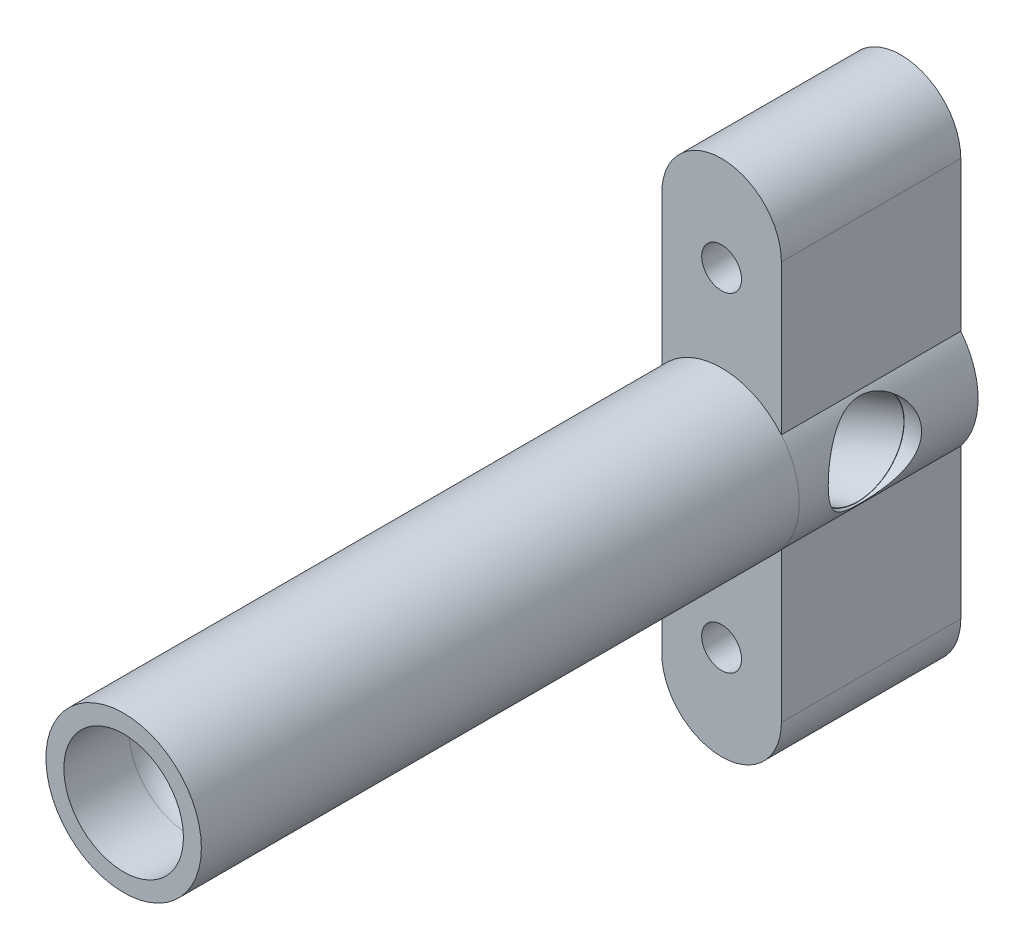
ISO-10303-21;
HEADER;
FILE_DESCRIPTION(('STEP AP214'),'2;1');
FILE_NAME('part.step','',(''),(''),'','','');
FILE_SCHEMA(('AUTOMOTIVE_DESIGN { 1 0 10303 214 1 1 1 1 }'));
ENDSEC;
DATA;
#1=APPLICATION_CONTEXT('core data for automotive mechanical design processes');
#2=APPLICATION_PROTOCOL_DEFINITION('international standard','automotive_design',2000,#1);
#3=PRODUCT_CONTEXT('',#1,'mechanical');
#4=PRODUCT('Part','Part','',(#3));
#5=PRODUCT_RELATED_PRODUCT_CATEGORY('part','',(#4));
#6=PRODUCT_DEFINITION_FORMATION('','',#4);
#7=PRODUCT_DEFINITION_CONTEXT('part definition',#1,'design');
#8=PRODUCT_DEFINITION('design','',#6,#7);
#9=PRODUCT_DEFINITION_SHAPE('','',#8);
#10=(LENGTH_UNIT() NAMED_UNIT(*) SI_UNIT(.MILLI.,.METRE.));
#11=(NAMED_UNIT(*) PLANE_ANGLE_UNIT() SI_UNIT($,.RADIAN.));
#12=(NAMED_UNIT(*) SI_UNIT($,.STERADIAN.) SOLID_ANGLE_UNIT());
#13=UNCERTAINTY_MEASURE_WITH_UNIT(LENGTH_MEASURE(1.E-05),#10,'distance_accuracy_value','');
#14=(GEOMETRIC_REPRESENTATION_CONTEXT(3) GLOBAL_UNCERTAINTY_ASSIGNED_CONTEXT((#13)) GLOBAL_UNIT_ASSIGNED_CONTEXT((#10,
#11,#12)) REPRESENTATION_CONTEXT('',''));
#15=CARTESIAN_POINT('',(0.,0.,0.));
#16=DIRECTION('',(0.,0.,1.));
#17=DIRECTION('',(1.,0.,0.));
#18=AXIS2_PLACEMENT_3D('',#15,#16,#17);
#19=CARTESIAN_POINT('',(0.,0.,30.));
#20=DIRECTION('',(0.,0.,-1.));
#21=DIRECTION('',(-1.,0.,0.));
#22=AXIS2_PLACEMENT_3D('',#19,#20,#21);
#23=CYLINDRICAL_SURFACE('',#22,2.);
#24=CARTESIAN_POINT('',(0.,0.,24.0862994965043));
#25=DIRECTION('',(0.,0.,-1.));
#26=DIRECTION('',(-1.,0.,0.));
#27=AXIS2_PLACEMENT_3D('',#24,#25,#26);
#28=CIRCLE('',#27,2.);
#29=CARTESIAN_POINT('',(-2.,0.,24.0862994965043));
#30=VERTEX_POINT('',#29);
#31=EDGE_CURVE('E101',#30,#30,#28,.F.);
#32=ORIENTED_EDGE('',*,*,#31,.T.);
#33=EDGE_LOOP('',(#32));
#34=FACE_BOUND('',#33,.T.);
#35=CARTESIAN_POINT('',(0.,0.,0.));
#36=DIRECTION('',(0.,0.,1.));
#37=DIRECTION('',(1.,0.,0.));
#38=AXIS2_PLACEMENT_3D('',#35,#36,#37);
#39=CIRCLE('',#38,2.);
#40=CARTESIAN_POINT('',(2.,0.,0.));
#41=VERTEX_POINT('',#40);
#42=EDGE_CURVE('E227',#41,#41,#39,.T.);
#43=ORIENTED_EDGE('',*,*,#42,.F.);
#44=EDGE_LOOP('',(#43));
#45=FACE_BOUND('',#44,.T.);
#46=ADVANCED_FACE('F93',(#34,#45),#23,.F.);
#47=CARTESIAN_POINT('',(0.,0.,0.));
#48=DIRECTION('',(0.,0.,1.));
#49=DIRECTION('',(1.,0.,0.));
#50=AXIS2_PLACEMENT_3D('',#47,#48,#49);
#51=PLANE('',#50);
#52=CARTESIAN_POINT('',(-0.128897569432405,0.,0.));
#53=DIRECTION('',(0.,0.,-1.));
#54=DIRECTION('',(-1.,0.,0.));
#55=AXIS2_PLACEMENT_3D('',#52,#53,#54);
#56=CIRCLE('',#55,4.);
#57=CARTESIAN_POINT('',(3.,2.49198715887542,0.));
#58=VERTEX_POINT('',#57);
#59=CARTESIAN_POINT('',(3.,-2.49198715887542,0.));
#60=VERTEX_POINT('',#59);
#61=EDGE_CURVE('E163',#58,#60,#56,.T.);
#62=ORIENTED_EDGE('',*,*,#61,.F.);
#63=CARTESIAN_POINT('',(0.,0.,0.));
#64=DIRECTION('',(0.,0.,1.));
#65=DIRECTION('',(1.,0.,0.));
#66=AXIS2_PLACEMENT_3D('',#63,#64,#65);
#67=CIRCLE('',#66,3.9);
#68=EDGE_CURVE('E211',#60,#58,#67,.T.);
#69=ORIENTED_EDGE('',*,*,#68,.F.);
#70=EDGE_LOOP('',(#62,#69));
#71=FACE_BOUND('',#70,.T.);
#72=ADVANCED_FACE('F241',(#71),#51,.F.);
#73=CARTESIAN_POINT('',(3.,10.,-9.));
#74=DIRECTION('',(-1.,0.,0.));
#75=DIRECTION('',(0.,-1.,0.));
#76=AXIS2_PLACEMENT_3D('',#73,#74,#75);
#77=PLANE('',#76);
#78=DIRECTION('',(0.,0.,1.));
#79=VECTOR('',#78,1.);
#80=CARTESIAN_POINT('',(3.,-2.49198715887542,-9.));
#81=LINE('',#80,#79);
#82=CARTESIAN_POINT('',(3.,-2.49198715887542,-9.));
#83=VERTEX_POINT('',#82);
#84=EDGE_CURVE('E108',#83,#60,#81,.T.);
#85=ORIENTED_EDGE('',*,*,#84,.T.);
#86=DIRECTION('',(0.,-1.,0.));
#87=VECTOR('',#86,1.);
#88=CARTESIAN_POINT('',(3.,10.,0.));
#89=LINE('',#88,#87);
#90=CARTESIAN_POINT('',(3.,-10.,0.));
#91=VERTEX_POINT('',#90);
#92=EDGE_CURVE('E192',#60,#91,#89,.T.);
#93=ORIENTED_EDGE('',*,*,#92,.T.);
#94=DIRECTION('',(0.,0.,1.));
#95=VECTOR('',#94,1.);
#96=CARTESIAN_POINT('',(3.,-10.,-9.));
#97=LINE('',#96,#95);
#98=CARTESIAN_POINT('',(3.,-10.,-9.));
#99=VERTEX_POINT('',#98);
#100=EDGE_CURVE('E206',#99,#91,#97,.T.);
#101=ORIENTED_EDGE('',*,*,#100,.F.);
#102=DIRECTION('',(0.,-1.,0.));
#103=VECTOR('',#102,1.);
#104=CARTESIAN_POINT('',(3.,10.,-9.));
#105=LINE('',#104,#103);
#106=EDGE_CURVE('E178',#83,#99,#105,.T.);
#107=ORIENTED_EDGE('',*,*,#106,.F.);
#108=EDGE_LOOP('',(#85,#93,#101,#107));
#109=FACE_BOUND('',#108,.T.);
#110=ADVANCED_FACE('F388',(#109),#77,.F.);
#111=DIRECTION('',(0.,0.,1.));
#112=VECTOR('',#111,1.);
#113=CARTESIAN_POINT('',(3.,2.49198715887542,-9.));
#114=LINE('',#113,#112);
#115=CARTESIAN_POINT('',(3.,2.49198715887542,-9.));
#116=VERTEX_POINT('',#115);
#117=EDGE_CURVE('E158',#116,#58,#114,.T.);
#118=ORIENTED_EDGE('',*,*,#117,.F.);
#119=CARTESIAN_POINT('',(3.,10.,-9.));
#120=VERTEX_POINT('',#119);
#121=EDGE_CURVE('E169',#120,#116,#105,.T.);
#122=ORIENTED_EDGE('',*,*,#121,.F.);
#123=DIRECTION('',(0.,0.,1.));
#124=VECTOR('',#123,1.);
#125=CARTESIAN_POINT('',(3.,10.,-9.));
#126=LINE('',#125,#124);
#127=CARTESIAN_POINT('',(3.,10.,0.));
#128=VERTEX_POINT('',#127);
#129=EDGE_CURVE('E209',#120,#128,#126,.T.);
#130=ORIENTED_EDGE('',*,*,#129,.T.);
#131=EDGE_CURVE('E171',#128,#58,#89,.T.);
#132=ORIENTED_EDGE('',*,*,#131,.T.);
#133=EDGE_LOOP('',(#118,#122,#130,#132));
#134=FACE_BOUND('',#133,.T.);
#135=ADVANCED_FACE('F167',(#134),#77,.F.);
#136=CARTESIAN_POINT('',(0.128897569432415,0.,0.));
#137=DIRECTION('',(0.,0.,-1.));
#138=DIRECTION('',(-1.,0.,0.));
#139=AXIS2_PLACEMENT_3D('',#136,#137,#138);
#140=CIRCLE('',#139,4.00000000000001);
#141=CARTESIAN_POINT('',(-3.,-2.49198715887542,0.));
#142=VERTEX_POINT('',#141);
#143=CARTESIAN_POINT('',(-3.,2.49198715887542,0.));
#144=VERTEX_POINT('',#143);
#145=EDGE_CURVE('E351',#142,#144,#140,.T.);
#146=ORIENTED_EDGE('',*,*,#145,.F.);
#147=EDGE_CURVE('E219',#144,#142,#67,.T.);
#148=ORIENTED_EDGE('',*,*,#147,.F.);
#149=EDGE_LOOP('',(#146,#148));
#150=FACE_BOUND('',#149,.T.);
#151=ADVANCED_FACE('F251',(#150),#51,.F.);
#152=CARTESIAN_POINT('',(-3.,10.,-9.));
#153=DIRECTION('',(1.,0.,0.));
#154=DIRECTION('',(0.,1.,0.));
#155=AXIS2_PLACEMENT_3D('',#152,#153,#154);
#156=PLANE('',#155);
#157=DIRECTION('',(0.,0.,1.));
#158=VECTOR('',#157,1.);
#159=CARTESIAN_POINT('',(-3.,2.49198715887542,-9.));
#160=LINE('',#159,#158);
#161=CARTESIAN_POINT('',(-3.,2.49198715887542,-9.));
#162=VERTEX_POINT('',#161);
#163=EDGE_CURVE('E116',#162,#144,#160,.T.);
#164=ORIENTED_EDGE('',*,*,#163,.T.);
#165=DIRECTION('',(0.,1.,0.));
#166=VECTOR('',#165,1.);
#167=CARTESIAN_POINT('',(-3.,10.,0.));
#168=LINE('',#167,#166);
#169=CARTESIAN_POINT('',(-3.,10.,0.));
#170=VERTEX_POINT('',#169);
#171=EDGE_CURVE('E197',#144,#170,#168,.T.);
#172=ORIENTED_EDGE('',*,*,#171,.T.);
#173=DIRECTION('',(0.,0.,1.));
#174=VECTOR('',#173,1.);
#175=CARTESIAN_POINT('',(-3.,10.,-9.));
#176=LINE('',#175,#174);
#177=CARTESIAN_POINT('',(-3.,10.,-9.));
#178=VERTEX_POINT('',#177);
#179=EDGE_CURVE('E188',#178,#170,#176,.T.);
#180=ORIENTED_EDGE('',*,*,#179,.F.);
#181=DIRECTION('',(0.,1.,0.));
#182=VECTOR('',#181,1.);
#183=CARTESIAN_POINT('',(-3.,10.,-9.));
#184=LINE('',#183,#182);
#185=EDGE_CURVE('E180',#162,#178,#184,.T.);
#186=ORIENTED_EDGE('',*,*,#185,.F.);
#187=EDGE_LOOP('',(#164,#172,#180,#186));
#188=FACE_BOUND('',#187,.T.);
#189=ADVANCED_FACE('F254',(#188),#156,.F.);
#190=DIRECTION('',(0.,0.,1.));
#191=VECTOR('',#190,1.);
#192=CARTESIAN_POINT('',(-3.,-2.49198715887542,-9.));
#193=LINE('',#192,#191);
#194=CARTESIAN_POINT('',(-3.,-2.49198715887542,-9.));
#195=VERTEX_POINT('',#194);
#196=EDGE_CURVE('E354',#195,#142,#193,.T.);
#197=ORIENTED_EDGE('',*,*,#196,.F.);
#198=CARTESIAN_POINT('',(-3.,-10.,-9.));
#199=VERTEX_POINT('',#198);
#200=EDGE_CURVE('E185',#199,#195,#184,.T.);
#201=ORIENTED_EDGE('',*,*,#200,.F.);
#202=DIRECTION('',(0.,0.,1.));
#203=VECTOR('',#202,1.);
#204=CARTESIAN_POINT('',(-3.,-10.,-9.));
#205=LINE('',#204,#203);
#206=CARTESIAN_POINT('',(-3.,-10.,0.));
#207=VERTEX_POINT('',#206);
#208=EDGE_CURVE('E203',#199,#207,#205,.T.);
#209=ORIENTED_EDGE('',*,*,#208,.T.);
#210=EDGE_CURVE('E198',#207,#142,#168,.T.);
#211=ORIENTED_EDGE('',*,*,#210,.T.);
#212=EDGE_LOOP('',(#197,#201,#209,#211));
#213=FACE_BOUND('',#212,.T.);
#214=ADVANCED_FACE('F249',(#213),#156,.F.);
#215=CARTESIAN_POINT('',(0.,0.,30.));
#216=DIRECTION('',(0.,0.,1.));
#217=DIRECTION('',(1.,0.,0.));
#218=AXIS2_PLACEMENT_3D('',#215,#216,#217);
#219=PLANE('',#218);
#220=CARTESIAN_POINT('',(0.,0.,30.));
#221=DIRECTION('',(0.,0.,1.));
#222=DIRECTION('',(1.,0.,0.));
#223=AXIS2_PLACEMENT_3D('',#220,#221,#222);
#224=CIRCLE('',#223,3.);
#225=CARTESIAN_POINT('',(3.,0.,30.));
#226=VERTEX_POINT('',#225);
#227=EDGE_CURVE('E281',#226,#226,#224,.T.);
#228=ORIENTED_EDGE('',*,*,#227,.F.);
#229=EDGE_LOOP('',(#228));
#230=FACE_BOUND('',#229,.T.);
#231=CARTESIAN_POINT('',(0.,0.,30.));
#232=DIRECTION('',(0.,0.,1.));
#233=DIRECTION('',(1.,0.,0.));
#234=AXIS2_PLACEMENT_3D('',#231,#232,#233);
#235=CIRCLE('',#234,3.9);
#236=CARTESIAN_POINT('',(3.9,0.,30.));
#237=VERTEX_POINT('',#236);
#238=EDGE_CURVE('E212',#237,#237,#235,.T.);
#239=ORIENTED_EDGE('',*,*,#238,.T.);
#240=EDGE_LOOP('',(#239));
#241=FACE_BOUND('',#240,.T.);
#242=ADVANCED_FACE('F245',(#230,#241),#219,.T.);
#243=CARTESIAN_POINT('',(0.,0.,30.));
#244=DIRECTION('',(0.,0.,-1.));
#245=DIRECTION('',(-1.,0.,0.));
#246=AXIS2_PLACEMENT_3D('',#243,#244,#245);
#247=CYLINDRICAL_SURFACE('',#246,3.9);
#248=ORIENTED_EDGE('',*,*,#238,.F.);
#249=EDGE_LOOP('',(#248));
#250=FACE_BOUND('',#249,.T.);
#251=EDGE_CURVE('E216',#58,#144,#67,.T.);
#252=ORIENTED_EDGE('',*,*,#251,.T.);
#253=ORIENTED_EDGE('',*,*,#147,.T.);
#254=EDGE_CURVE('E403',#142,#60,#67,.T.);
#255=ORIENTED_EDGE('',*,*,#254,.T.);
#256=ORIENTED_EDGE('',*,*,#68,.T.);
#257=EDGE_LOOP('',(#252,#253,#255,#256));
#258=FACE_BOUND('',#257,.T.);
#259=ADVANCED_FACE('F248',(#250,#258),#247,.T.);
#260=CARTESIAN_POINT('',(0.,10.,0.));
#261=DIRECTION('',(0.,0.,-1.));
#262=DIRECTION('',(-1.,0.,0.));
#263=AXIS2_PLACEMENT_3D('',#260,#261,#262);
#264=PLANE('',#263);
#265=CARTESIAN_POINT('',(0.,-8.25,0.));
#266=DIRECTION('',(0.,0.,-1.));
#267=DIRECTION('',(-1.,0.,0.));
#268=AXIS2_PLACEMENT_3D('',#265,#266,#267);
#269=CIRCLE('',#268,1.);
#270=CARTESIAN_POINT('',(-1.,-8.25,0.));
#271=VERTEX_POINT('',#270);
#272=EDGE_CURVE('E361',#271,#271,#269,.T.);
#273=ORIENTED_EDGE('',*,*,#272,.T.);
#274=EDGE_LOOP('',(#273));
#275=FACE_BOUND('',#274,.T.);
#276=ORIENTED_EDGE('',*,*,#254,.F.);
#277=ORIENTED_EDGE('',*,*,#210,.F.);
#278=CARTESIAN_POINT('',(0.,-10.,0.));
#279=DIRECTION('',(0.,0.,-1.));
#280=DIRECTION('',(-1.,0.,0.));
#281=AXIS2_PLACEMENT_3D('',#278,#279,#280);
#282=CIRCLE('',#281,3.);
#283=EDGE_CURVE('E195',#91,#207,#282,.T.);
#284=ORIENTED_EDGE('',*,*,#283,.F.);
#285=ORIENTED_EDGE('',*,*,#92,.F.);
#286=EDGE_LOOP('',(#276,#277,#284,#285));
#287=FACE_BOUND('',#286,.T.);
#288=ADVANCED_FACE('F257',(#275,#287),#264,.F.);
#289=CARTESIAN_POINT('',(0.,10.,-9.));
#290=DIRECTION('',(0.,0.,-1.));
#291=DIRECTION('',(-1.,0.,0.));
#292=AXIS2_PLACEMENT_3D('',#289,#290,#291);
#293=PLANE('',#292);
#294=CARTESIAN_POINT('',(0.,-8.25,-9.));
#295=DIRECTION('',(0.,0.,-1.));
#296=DIRECTION('',(-1.,0.,0.));
#297=AXIS2_PLACEMENT_3D('',#294,#295,#296);
#298=CIRCLE('',#297,1.);
#299=CARTESIAN_POINT('',(-1.,-8.25,-9.));
#300=VERTEX_POINT('',#299);
#301=EDGE_CURVE('E358',#300,#300,#298,.T.);
#302=ORIENTED_EDGE('',*,*,#301,.F.);
#303=EDGE_LOOP('',(#302));
#304=FACE_BOUND('',#303,.T.);
#305=CARTESIAN_POINT('',(0.,8.25,-9.));
#306=DIRECTION('',(0.,0.,-1.));
#307=DIRECTION('',(-1.,0.,0.));
#308=AXIS2_PLACEMENT_3D('',#305,#306,#307);
#309=CIRCLE('',#308,1.);
#310=CARTESIAN_POINT('',(-1.,8.25,-9.));
#311=VERTEX_POINT('',#310);
#312=EDGE_CURVE('E222',#311,#311,#309,.T.);
#313=ORIENTED_EDGE('',*,*,#312,.F.);
#314=EDGE_LOOP('',(#313));
#315=FACE_BOUND('',#314,.T.);
#316=CARTESIAN_POINT('',(0.,10.,-9.));
#317=DIRECTION('',(0.,0.,-1.));
#318=DIRECTION('',(-1.,0.,0.));
#319=AXIS2_PLACEMENT_3D('',#316,#317,#318);
#320=CIRCLE('',#319,3.);
#321=EDGE_CURVE('E175',#178,#120,#320,.T.);
#322=ORIENTED_EDGE('',*,*,#321,.T.);
#323=ORIENTED_EDGE('',*,*,#121,.T.);
#324=CARTESIAN_POINT('',(-0.128897569432405,0.,-9.));
#325=DIRECTION('',(0.,0.,-1.));
#326=DIRECTION('',(-1.,0.,0.));
#327=AXIS2_PLACEMENT_3D('',#324,#325,#326);
#328=CIRCLE('',#327,4.);
#329=EDGE_CURVE('E155',#116,#83,#328,.T.);
#330=ORIENTED_EDGE('',*,*,#329,.T.);
#331=ORIENTED_EDGE('',*,*,#106,.T.);
#332=CARTESIAN_POINT('',(0.,-10.,-9.));
#333=DIRECTION('',(0.,0.,-1.));
#334=DIRECTION('',(-1.,0.,0.));
#335=AXIS2_PLACEMENT_3D('',#332,#333,#334);
#336=CIRCLE('',#335,3.);
#337=EDGE_CURVE('E177',#99,#199,#336,.T.);
#338=ORIENTED_EDGE('',*,*,#337,.T.);
#339=ORIENTED_EDGE('',*,*,#200,.T.);
#340=CARTESIAN_POINT('',(0.128897569432415,0.,-9.));
#341=DIRECTION('',(0.,0.,-1.));
#342=DIRECTION('',(-1.,0.,0.));
#343=AXIS2_PLACEMENT_3D('',#340,#341,#342);
#344=CIRCLE('',#343,4.00000000000001);
#345=EDGE_CURVE('E352',#195,#162,#344,.T.);
#346=ORIENTED_EDGE('',*,*,#345,.T.);
#347=ORIENTED_EDGE('',*,*,#185,.T.);
#348=EDGE_LOOP('',(#322,#323,#330,#331,#338,#339,#346,#347));
#349=FACE_BOUND('',#348,.T.);
#350=ADVANCED_FACE('F173',(#304,#315,#349),#293,.T.);
#351=CARTESIAN_POINT('',(0.,-10.,-9.));
#352=DIRECTION('',(0.,0.,1.));
#353=DIRECTION('',(1.,0.,0.));
#354=AXIS2_PLACEMENT_3D('',#351,#352,#353);
#355=CYLINDRICAL_SURFACE('',#354,3.);
#356=ORIENTED_EDGE('',*,*,#283,.T.);
#357=ORIENTED_EDGE('',*,*,#208,.F.);
#358=ORIENTED_EDGE('',*,*,#337,.F.);
#359=ORIENTED_EDGE('',*,*,#100,.T.);
#360=EDGE_LOOP('',(#356,#357,#358,#359));
#361=FACE_BOUND('',#360,.T.);
#362=ADVANCED_FACE('F370',(#361),#355,.T.);
#363=CARTESIAN_POINT('',(0.,10.,-9.));
#364=DIRECTION('',(0.,0.,1.));
#365=DIRECTION('',(1.,0.,0.));
#366=AXIS2_PLACEMENT_3D('',#363,#364,#365);
#367=CYLINDRICAL_SURFACE('',#366,3.);
#368=CARTESIAN_POINT('',(0.,10.,0.));
#369=DIRECTION('',(0.,0.,-1.));
#370=DIRECTION('',(-1.,0.,0.));
#371=AXIS2_PLACEMENT_3D('',#368,#369,#370);
#372=CIRCLE('',#371,3.);
#373=EDGE_CURVE('E189',#170,#128,#372,.T.);
#374=ORIENTED_EDGE('',*,*,#373,.T.);
#375=ORIENTED_EDGE('',*,*,#129,.F.);
#376=ORIENTED_EDGE('',*,*,#321,.F.);
#377=ORIENTED_EDGE('',*,*,#179,.T.);
#378=EDGE_LOOP('',(#374,#375,#376,#377));
#379=FACE_BOUND('',#378,.T.);
#380=ADVANCED_FACE('F243',(#379),#367,.T.);
#381=CARTESIAN_POINT('',(0.,8.25,0.));
#382=DIRECTION('',(0.,0.,-1.));
#383=DIRECTION('',(-1.,0.,0.));
#384=AXIS2_PLACEMENT_3D('',#381,#382,#383);
#385=CIRCLE('',#384,1.);
#386=CARTESIAN_POINT('',(-1.,8.25,0.));
#387=VERTEX_POINT('',#386);
#388=EDGE_CURVE('E193',#387,#387,#385,.T.);
#389=ORIENTED_EDGE('',*,*,#388,.T.);
#390=EDGE_LOOP('',(#389));
#391=FACE_BOUND('',#390,.T.);
#392=ORIENTED_EDGE('',*,*,#251,.F.);
#393=ORIENTED_EDGE('',*,*,#131,.F.);
#394=ORIENTED_EDGE('',*,*,#373,.F.);
#395=ORIENTED_EDGE('',*,*,#171,.F.);
#396=EDGE_LOOP('',(#392,#393,#394,#395));
#397=FACE_BOUND('',#396,.T.);
#398=ADVANCED_FACE('F381',(#391,#397),#264,.F.);
#399=CARTESIAN_POINT('',(0.,8.25,30.));
#400=DIRECTION('',(0.,0.,-1.));
#401=DIRECTION('',(-1.,0.,0.));
#402=AXIS2_PLACEMENT_3D('',#399,#400,#401);
#403=CYLINDRICAL_SURFACE('',#402,1.);
#404=ORIENTED_EDGE('',*,*,#312,.T.);
#405=EDGE_LOOP('',(#404));
#406=FACE_BOUND('',#405,.T.);
#407=ORIENTED_EDGE('',*,*,#388,.F.);
#408=EDGE_LOOP('',(#407));
#409=FACE_BOUND('',#408,.T.);
#410=ADVANCED_FACE('F366',(#406,#409),#403,.F.);
#411=CARTESIAN_POINT('',(0.,-8.25,30.));
#412=DIRECTION('',(0.,0.,-1.));
#413=DIRECTION('',(-1.,0.,0.));
#414=AXIS2_PLACEMENT_3D('',#411,#412,#413);
#415=CYLINDRICAL_SURFACE('',#414,1.);
#416=ORIENTED_EDGE('',*,*,#301,.T.);
#417=EDGE_LOOP('',(#416));
#418=FACE_BOUND('',#417,.T.);
#419=ORIENTED_EDGE('',*,*,#272,.F.);
#420=EDGE_LOOP('',(#419));
#421=FACE_BOUND('',#420,.T.);
#422=ADVANCED_FACE('F427',(#418,#421),#415,.F.);
#423=CARTESIAN_POINT('',(0.128897569432415,0.,-9.));
#424=DIRECTION('',(0.,0.,1.));
#425=DIRECTION('',(1.,0.,0.));
#426=AXIS2_PLACEMENT_3D('',#423,#424,#425);
#427=CYLINDRICAL_SURFACE('',#426,4.00000000000001);
#428=ORIENTED_EDGE('',*,*,#145,.T.);
#429=ORIENTED_EDGE('',*,*,#163,.F.);
#430=ORIENTED_EDGE('',*,*,#345,.F.);
#431=ORIENTED_EDGE('',*,*,#196,.T.);
#432=EDGE_LOOP('',(#428,#429,#430,#431));
#433=FACE_BOUND('',#432,.T.);
#434=ADVANCED_FACE('F462',(#433),#427,.T.);
#435=CARTESIAN_POINT('',(-0.128897569432405,0.,-9.));
#436=DIRECTION('',(0.,0.,1.));
#437=DIRECTION('',(1.,0.,0.));
#438=AXIS2_PLACEMENT_3D('',#435,#436,#437);
#439=CYLINDRICAL_SURFACE('',#438,4.);
#440=CARTESIAN_POINT('',(3.11396580196192,-2.34175941430136,-3.82047814666757));
#441=CARTESIAN_POINT('',(3.11396439379858,-2.34176063679587,-3.93899371914675));
#442=CARTESIAN_POINT('',(3.12056039433515,-2.33270687839639,-4.05750352239552));
#443=CARTESIAN_POINT('',(3.14580620828983,-2.29712179273538,-4.29058440438787));
#444=CARTESIAN_POINT('',(3.16446841393772,-2.27057249667353,-4.40515130614586));
#445=CARTESIAN_POINT('',(3.21088635477007,-2.20171133770758,-4.62649771628095));
#446=CARTESIAN_POINT('',(3.23857984788168,-2.15950709981125,-4.73332457658823));
#447=CARTESIAN_POINT('',(3.29982760853326,-2.06087561746059,-4.93832577212712));
#448=CARTESIAN_POINT('',(3.33338374363086,-2.00444383824572,-5.0364973351553));
#449=CARTESIAN_POINT('',(3.4072779035614,-1.87133606585173,-5.23387877134194));
#450=CARTESIAN_POINT('',(3.44795131427409,-1.79307265849583,-5.33189284657235));
#451=CARTESIAN_POINT('',(3.52880626602609,-1.62178414504004,-5.5143873994388));
#452=CARTESIAN_POINT('',(3.56898744498768,-1.52874880181278,-5.59885840937437));
#453=CARTESIAN_POINT('',(3.64915843614975,-1.3191309312293,-5.76030831570959));
#454=CARTESIAN_POINT('',(3.68871790418373,-1.20111854852313,-5.83566548679722));
#455=CARTESIAN_POINT('',(3.75848172243165,-0.951334878426315,-5.96489330523376));
#456=CARTESIAN_POINT('',(3.7886942088889,-0.819575691560027,-6.01878265144843));
#457=CARTESIAN_POINT('',(3.83387588780563,-0.558831123017535,-6.09827861512173));
#458=CARTESIAN_POINT('',(3.84999034235537,-0.43070265590199,-6.12602846433626));
#459=CARTESIAN_POINT('',(3.86957754830339,-0.170695039805682,-6.15967426974438));
#460=CARTESIAN_POINT('',(3.87306144615441,-0.0388193014401238,-6.16558949505394));
#461=CARTESIAN_POINT('',(3.86736567799532,0.208140766233312,-6.15584883875124));
#462=CARTESIAN_POINT('',(3.85963445071957,0.323367032432822,-6.14266049576385));
#463=CARTESIAN_POINT('',(3.83479511874107,0.549629066563291,-6.09973322833458));
#464=CARTESIAN_POINT('',(3.81768632172706,0.660664524455403,-6.06999308193182));
#465=CARTESIAN_POINT('',(3.77542324485951,0.876637075512114,-5.9949945534139));
#466=CARTESIAN_POINT('',(3.75020995193286,0.981522549421228,-5.94962216502747));
#467=CARTESIAN_POINT('',(3.69379210505191,1.18234435125143,-5.84501065175676));
#468=CARTESIAN_POINT('',(3.66258588617204,1.27827818123948,-5.78576767240755));
#469=CARTESIAN_POINT('',(3.59259221586764,1.47042301744334,-5.64730681958252));
#470=CARTESIAN_POINT('',(3.55334516267469,1.56536936436362,-5.56656735830878));
#471=CARTESIAN_POINT('',(3.47355988486283,1.74116102889759,-5.39134618939536));
#472=CARTESIAN_POINT('',(3.43302005547586,1.82198794430832,-5.29684683779346));
#473=CARTESIAN_POINT('',(3.35016491700392,1.97599522623203,-5.08470289787528));
#474=CARTESIAN_POINT('',(3.30812730726572,2.0474192622523,-4.9656622241946));
#475=CARTESIAN_POINT('',(3.2328593898424,2.16880717910189,-4.71460363143573));
#476=CARTESIAN_POINT('',(3.19961314470671,2.21880999695933,-4.58260979871997));
#477=CARTESIAN_POINT('',(3.15399289797682,2.28557580343583,-4.34169965528729));
#478=CARTESIAN_POINT('',(3.13853352938318,2.30741933251402,-4.23477523397161));
#479=CARTESIAN_POINT('',(3.11818933700856,2.33596899093349,-4.01797641363749));
#480=CARTESIAN_POINT('',(3.11329335781124,2.34269108950854,-3.90810525081916));
#481=CARTESIAN_POINT('',(3.11478994351028,2.34061766130875,-3.688491359905));
#482=CARTESIAN_POINT('',(3.12119325078354,2.3318073676963,-3.57874885339416));
#483=CARTESIAN_POINT('',(3.1443595097408,2.29916792481121,-3.36262436048631));
#484=CARTESIAN_POINT('',(3.16113033890059,2.27532735492386,-3.25624499414542));
#485=CARTESIAN_POINT('',(3.20297672376195,2.21359357151703,-3.0486955261061));
#486=CARTESIAN_POINT('',(3.22810343227752,2.17561362441047,-2.94756205972855));
#487=CARTESIAN_POINT('',(3.28394702251412,2.08691973588066,-2.75273507189495));
#488=CARTESIAN_POINT('',(3.31466609920194,2.03620079150867,-2.65904449253487));
#489=CARTESIAN_POINT('',(3.38465633782233,1.91331041712656,-2.4645626822589));
#490=CARTESIAN_POINT('',(3.42448681443908,1.83894417762859,-2.36535687343492));
#491=CARTESIAN_POINT('',(3.50439351130704,1.67555376752444,-2.17985187903826));
#492=CARTESIAN_POINT('',(3.54446992024326,1.58651648350196,-2.09356437312972));
#493=CARTESIAN_POINT('',(3.62576264079785,1.38409611441218,-1.92647950164897));
#494=CARTESIAN_POINT('',(3.66658754919491,1.26909447444993,-1.84743103770201));
#495=CARTESIAN_POINT('',(3.73969954123249,1.02477641256536,-1.71020491145822));
#496=CARTESIAN_POINT('',(3.77199293475998,0.895470670909531,-1.65201181316336));
#497=CARTESIAN_POINT('',(3.82213515047048,0.636657357243657,-1.56310486344626));
#498=CARTESIAN_POINT('',(3.84091292983481,0.507949528187829,-1.53060411559273));
#499=CARTESIAN_POINT('',(3.86571080903673,0.24572948958635,-1.48787268660843));
#500=CARTESIAN_POINT('',(3.87174366427927,0.11222221969647,-1.47761973910262));
#501=CARTESIAN_POINT('',(3.87043681744544,-0.137792699676651,-1.4798589106011));
#502=CARTESIAN_POINT('',(3.86467104934428,-0.254343894224863,-1.48967383508827));
#503=CARTESIAN_POINT('',(3.84340629348672,-0.483813003686978,-1.52629888940355));
#504=CARTESIAN_POINT('',(3.82790696927495,-0.596730792864778,-1.55310960671776));
#505=CARTESIAN_POINT('',(3.788697069576,-0.815302447936565,-1.62225477488605));
#506=CARTESIAN_POINT('',(3.76504074168845,-0.92099890977907,-1.66448677436537));
#507=CARTESIAN_POINT('',(3.71140289492011,-1.12388508983386,-1.76294391061481));
#508=CARTESIAN_POINT('',(3.6814198142052,-1.22107269913711,-1.81917250322723));
#509=CARTESIAN_POINT('',(3.61378368711244,-1.41565362429528,-1.95097339390752));
#510=CARTESIAN_POINT('',(3.57565002398509,-1.51189915526585,-2.02799129735977));
#511=CARTESIAN_POINT('',(3.49746689199351,-1.69086972504206,-2.19571168879415));
#512=CARTESIAN_POINT('',(3.45741521689182,-1.77357868556349,-2.28643020761383));
#513=CARTESIAN_POINT('',(3.37437602425047,-1.93288310318842,-2.49136485325055));
#514=CARTESIAN_POINT('',(3.33158562756665,-2.00766146793439,-2.60708550544168));
#515=CARTESIAN_POINT('',(3.2535606509762,-2.13650946184903,-2.85185428080237));
#516=CARTESIAN_POINT('',(3.21831741509193,-2.19060287155156,-2.98088688172233));
#517=CARTESIAN_POINT('',(3.16589099555348,-2.26852823878925,-3.22758209510411));
#518=CARTESIAN_POINT('',(3.14670881434462,-2.29583945922794,-3.34370857601685));
#519=CARTESIAN_POINT('',(3.12075587736125,-2.33244143799238,-3.58005550334061));
#520=CARTESIAN_POINT('',(3.11396723023833,-2.34175817434573,-3.70026979261086));
#521=CARTESIAN_POINT('',(3.11396580196192,-2.34175941430136,-3.82047814666757));
#522=B_SPLINE_CURVE_WITH_KNOTS('',3,(#440,#441,#442,#443,#444,#445,#446,#447,#448,#449,#450,
#451,#452,#453,#454,#455,#456,#457,#458,#459,#460,#461,#462,#463,#464,#465,#466,#467,#468,#469,
#470,#471,#472,#473,#474,#475,#476,#477,#478,#479,#480,#481,#482,#483,#484,#485,#486,#487,#488,
#489,#490,#491,#492,#493,#494,#495,#496,#497,#498,#499,#500,#501,#502,#503,#504,#505,#506,#507,
#508,#509,#510,#511,#512,#513,#514,#515,#516,#517,#518,#519,#520,#521),.UNSPECIFIED.,.T.,.F.,(4,
2,2,2,2,2,2,2,2,2,2,2,2,2,2,2,2,2,2,2,2,2,2,2,2,2,2,2,2,2,2,2,2,2,2,2,2,2,2,2,4),(0.,
0.355043176100297,0.710451568971625,1.06346055771241,1.41658220397014,1.81058864632868,
2.20486934129397,2.63902588021203,3.07280342969845,3.46673623624584,3.86032131277401,
4.20737533010116,4.55445497259386,4.90412141906232,5.25388514906278,5.6443156645821,
6.03525130165282,6.46821674451159,6.90039181851514,7.22962577155108,7.55851186813491,
7.88771080943973,8.21716019145257,8.54866470016332,8.88029960378502,9.26943514015817,
9.65892040325718,10.092832259504,10.5264222914708,10.9262497244126,11.3256768111806,
11.6752890290381,12.0249133324462,12.3722559511604,12.7196844160526,13.1052387203727,
13.4912477008763,13.9219573046178,14.3521702420328,14.7128055980468,15.0729199266983),.UNSPECIFIED.);
#523=CARTESIAN_POINT('',(3.11396580196192,-2.34175941430136,-3.82047814666757));
#524=VERTEX_POINT('',#523);
#525=EDGE_CURVE('E285',#524,#524,#522,.T.);
#526=ORIENTED_EDGE('',*,*,#525,.F.);
#527=EDGE_LOOP('',(#526));
#528=FACE_BOUND('',#527,.T.);
#529=ORIENTED_EDGE('',*,*,#61,.T.);
#530=ORIENTED_EDGE('',*,*,#84,.F.);
#531=ORIENTED_EDGE('',*,*,#329,.F.);
#532=ORIENTED_EDGE('',*,*,#117,.T.);
#533=EDGE_LOOP('',(#529,#530,#531,#532));
#534=FACE_BOUND('',#533,.T.);
#535=ADVANCED_FACE('F157',(#528,#534),#439,.T.);
#536=CARTESIAN_POINT('',(-2.,0.,0.));
#537=CARTESIAN_POINT('',(-1.53612523295034,0.,-2.78770135090588));
#538=CARTESIAN_POINT('',(0.365016695786438,0.,-5.12459492775785));
#539=CARTESIAN_POINT('',(3.,0.,-6.14602608445109));
#540=CARTESIAN_POINT('',(-2.,0.261799385710012,0.));
#541=CARTESIAN_POINT('',(-1.53612523295034,0.27589348838184,-2.78770135090588));
#542=CARTESIAN_POINT('',(0.365016695786438,0.289987591053668,-5.12459492775785));
#543=CARTESIAN_POINT('',(3.,0.304081693725496,-6.14602608445109));
#544=CARTESIAN_POINT('',(-1.89599338142158,0.785273258445213,0.));
#545=CARTESIAN_POINT('',(-1.43662339083397,0.827558619954767,-2.72818030820145));
#546=CARTESIAN_POINT('',(0.423543097463413,0.869843981464321,-5.01732884457385));
#547=CARTESIAN_POINT('',(2.99999999999999,0.912129342973874,-6.02521789108417));
#548=CARTESIAN_POINT('',(-1.451036322676,1.4511389923768,0.));
#549=CARTESIAN_POINT('',(-1.02686999017991,1.52925066988222,-2.48370934987276));
#550=CARTESIAN_POINT('',(0.661327850110927,1.60736234738764,-4.57254693625971));
#551=CARTESIAN_POINT('',(3.,1.68547402489306,-5.50838602139703));
#552=CARTESIAN_POINT('',(-0.785310061486608,1.89591765182295,0.));
#553=CARTESIAN_POINT('',(-0.424690976633843,1.99798795776347,-2.12490099897338));
#554=CARTESIAN_POINT('',(1.00848863013263,2.10005826370399,-3.91675424614146));
#555=CARTESIAN_POINT('',(3.,2.20212856964451,-4.73517437611736));
#556=CARTESIAN_POINT('',(0.,2.05214818153829,0.));
#557=CARTESIAN_POINT('',(0.279833642741769,2.16262440746658,-1.70533735151668));
#558=CARTESIAN_POINT('',(1.4134038235332,2.27310063339487,-3.14828296457723));
#559=CARTESIAN_POINT('',(3.,2.38357685932316,-3.82301304222554));
#560=CARTESIAN_POINT('',(0.785310061486607,1.89591765182295,0.));
#561=CARTESIAN_POINT('',(0.984358262117381,1.99798795776347,-1.28577370406));
#562=CARTESIAN_POINT('',(1.81831901693377,2.10005826370399,-2.37981168301302));
#563=CARTESIAN_POINT('',(3.,2.20212856964451,-2.91085170833374));
#564=CARTESIAN_POINT('',(1.451036322676,1.45113899237679,0.));
#565=CARTESIAN_POINT('',(1.58653727566345,1.52925066988222,-0.926965353160606));
#566=CARTESIAN_POINT('',(2.16547979695547,1.60736234738764,-1.72401899289475));
#567=CARTESIAN_POINT('',(3.,1.68547402489307,-2.13764006305404));
#568=CARTESIAN_POINT('',(1.89599338142158,0.785273258445218,0.));
#569=CARTESIAN_POINT('',(1.99629067631751,0.827558619954771,-0.682494394831932));
#570=CARTESIAN_POINT('',(2.40326454960297,0.869843981464324,-1.27923708458063));
#571=CARTESIAN_POINT('',(3.,0.912129342973876,-1.62080819336693));
#572=CARTESIAN_POINT('',(2.,0.261799385710011,0.));
#573=CARTESIAN_POINT('',(2.09579251843388,0.27589348838184,-0.622973352127495));
#574=CARTESIAN_POINT('',(2.46179095127995,0.289987591053668,-1.17197100139661));
#575=CARTESIAN_POINT('',(3.,0.304081693725496,-1.5));
#576=CARTESIAN_POINT('',(2.,-0.261799385710011,0.));
#577=CARTESIAN_POINT('',(2.09579251843388,-0.27589348838184,-0.622973352127495));
#578=CARTESIAN_POINT('',(2.46179095127995,-0.289987591053668,-1.17197100139661));
#579=CARTESIAN_POINT('',(3.,-0.304081693725497,-1.5));
#580=CARTESIAN_POINT('',(1.89599338142158,-0.785273258445214,0.));
#581=CARTESIAN_POINT('',(1.99629067631751,-0.827558619954768,-0.682494394831931));
#582=CARTESIAN_POINT('',(2.40326454960298,-0.869843981464322,-1.27923708458063));
#583=CARTESIAN_POINT('',(3.,-0.912129342973877,-1.62080819336693));
#584=CARTESIAN_POINT('',(1.451036322676,-1.45113899237679,0.));
#585=CARTESIAN_POINT('',(1.58653727566344,-1.52925066988222,-0.926965353160606));
#586=CARTESIAN_POINT('',(2.16547979695546,-1.60736234738764,-1.72401899289475));
#587=CARTESIAN_POINT('',(2.99999999999999,-1.68547402489306,-2.13764006305404));
#588=CARTESIAN_POINT('',(0.785310061486606,-1.89591765182295,0.));
#589=CARTESIAN_POINT('',(0.984358262117381,-1.99798795776347,-1.28577370406));
#590=CARTESIAN_POINT('',(1.81831901693377,-2.10005826370399,-2.37981168301302));
#591=CARTESIAN_POINT('',(3.,-2.20212856964451,-2.91085170833373));
#592=CARTESIAN_POINT('',(0.,-2.05214818153829,0.));
#593=CARTESIAN_POINT('',(0.279833642741767,-2.16262440746658,-1.70533735151669));
#594=CARTESIAN_POINT('',(1.41340382353319,-2.27310063339487,-3.14828296457724));
#595=CARTESIAN_POINT('',(2.99999999999999,-2.38357685932316,-3.82301304222554));
#596=CARTESIAN_POINT('',(-0.785310061486609,-1.89591765182295,0.));
#597=CARTESIAN_POINT('',(-0.424690976633844,-1.99798795776347,-2.12490099897337));
#598=CARTESIAN_POINT('',(1.00848863013263,-2.10005826370399,-3.91675424614144));
#599=CARTESIAN_POINT('',(3.,-2.20212856964451,-4.73517437611734));
#600=CARTESIAN_POINT('',(-1.45103632267599,-1.45113899237679,0.));
#601=CARTESIAN_POINT('',(-1.02686999017991,-1.52925066988222,-2.48370934987277));
#602=CARTESIAN_POINT('',(0.661327850110928,-1.60736234738764,-4.57254693625972));
#603=CARTESIAN_POINT('',(3.,-1.68547402489307,-5.50838602139705));
#604=CARTESIAN_POINT('',(-1.89599338142158,-0.785273258445215,0.));
#605=CARTESIAN_POINT('',(-1.43662339083397,-0.827558619954769,-2.72818030820144));
#606=CARTESIAN_POINT('',(0.423543097463414,-0.869843981464323,-5.01732884457384));
#607=CARTESIAN_POINT('',(3.,-0.912129342973878,-6.02521789108415));
#608=CARTESIAN_POINT('',(-2.,-0.261799385710011,0.));
#609=CARTESIAN_POINT('',(-1.53612523295034,-0.27589348838184,-2.78770135090588));
#610=CARTESIAN_POINT('',(0.365016695786438,-0.289987591053668,-5.12459492775785));
#611=CARTESIAN_POINT('',(3.,-0.304081693725497,-6.14602608445109));
#612=CARTESIAN_POINT('',(-2.,0.,0.));
#613=CARTESIAN_POINT('',(-1.53612523295034,0.,-2.78770135090588));
#614=CARTESIAN_POINT('',(0.365016695786438,0.,-5.12459492775785));
#615=CARTESIAN_POINT('',(3.,0.,-6.14602608445109));
#616=B_SPLINE_SURFACE_WITH_KNOTS('',3,3,((#536,#537,#538,#539),(#540,#541,#542,#543),(#544,#545,
#546,#547),(#548,#549,#550,#551),(#552,#553,#554,#555),(#556,#557,#558,#559),(#560,#561,#562,
#563),(#564,#565,#566,#567),(#568,#569,#570,#571),(#572,#573,#574,#575),(#576,#577,#578,#579),
(#580,#581,#582,#583),(#584,#585,#586,#587),(#588,#589,#590,#591),(#592,#593,#594,#595),(#596,
#597,#598,#599),(#600,#601,#602,#603),(#604,#605,#606,#607),(#608,#609,#610,#611),(#612,#613,
#614,#615)),.UNSPECIFIED.,.T.,.F.,.F.,(4,1,1,1,1,1,1,1,2,1,1,1,1,1,1,1,4),(4,4),(0.,0.0625,
0.125,0.1875,0.25,0.3125,0.375,0.4375,0.5,0.5625,0.625,0.6875,0.75,0.8125,0.875,0.9375,1.),(0.,
1.),.UNSPECIFIED.);
#617=CARTESIAN_POINT('',(3.,0.,-6.14602608445109));
#618=CARTESIAN_POINT('',(3.,0.304081693725496,-6.14602608445109));
#619=CARTESIAN_POINT('',(2.99999999999999,0.912129342973874,-6.02521789108417));
#620=CARTESIAN_POINT('',(3.,1.68547402489306,-5.50838602139703));
#621=CARTESIAN_POINT('',(3.,2.20212856964451,-4.73517437611736));
#622=CARTESIAN_POINT('',(3.,2.38357685932316,-3.82301304222554));
#623=CARTESIAN_POINT('',(3.,2.20212856964451,-2.91085170833374));
#624=CARTESIAN_POINT('',(3.,1.68547402489307,-2.13764006305404));
#625=CARTESIAN_POINT('',(3.,0.912129342973876,-1.62080819336693));
#626=CARTESIAN_POINT('',(3.,0.304081693725496,-1.5));
#627=CARTESIAN_POINT('',(3.,-0.304081693725497,-1.5));
#628=CARTESIAN_POINT('',(3.,-0.912129342973877,-1.62080819336693));
#629=CARTESIAN_POINT('',(2.99999999999999,-1.68547402489306,-2.13764006305404));
#630=CARTESIAN_POINT('',(3.,-2.20212856964451,-2.91085170833373));
#631=CARTESIAN_POINT('',(2.99999999999999,-2.38357685932316,-3.82301304222554));
#632=CARTESIAN_POINT('',(3.,-2.20212856964451,-4.73517437611734));
#633=CARTESIAN_POINT('',(3.,-1.68547402489307,-5.50838602139705));
#634=CARTESIAN_POINT('',(3.,-0.912129342973878,-6.02521789108415));
#635=CARTESIAN_POINT('',(3.,-0.304081693725497,-6.14602608445109));
#636=CARTESIAN_POINT('',(3.,0.,-6.14602608445109));
#637=B_SPLINE_CURVE_WITH_KNOTS('',3,(#617,#618,#619,#620,#621,#622,#623,#624,#625,#626,#627,
#628,#629,#630,#631,#632,#633,#634,#635,#636),.UNSPECIFIED.,.T.,.F.,(4,1,1,1,1,1,1,1,2,1,1,1,1,
1,1,1,4),(0.,0.0625,0.125,0.1875,0.25,0.3125,0.375,0.4375,0.5,0.5625,0.625,0.6875,0.75,0.8125,
0.875,0.9375,1.),.UNSPECIFIED.);
#638=CARTESIAN_POINT('',(3.,0.,-6.14602608445109));
#639=VERTEX_POINT('',#638);
#640=EDGE_CURVE('E294',#639,#639,#637,.T.);
#641=ORIENTED_EDGE('',*,*,#42,.T.);
#642=EDGE_LOOP('',(#641));
#643=FACE_BOUND('',#642,.T.);
#644=ORIENTED_EDGE('',*,*,#640,.T.);
#645=EDGE_LOOP('',(#644));
#646=FACE_BOUND('',#645,.T.);
#647=ADVANCED_FACE('F304',(#643,#646),#616,.F.);
#648=CARTESIAN_POINT('',(3.,0.,-3.82047814666757));
#649=DIRECTION('',(-1.,0.,0.));
#650=DIRECTION('',(0.,-1.,0.));
#651=AXIS2_PLACEMENT_3D('',#648,#649,#650);
#652=PLANE('',#651);
#653=CARTESIAN_POINT('',(3.,0.,-3.82047814666757));
#654=DIRECTION('',(-1.,0.,0.));
#655=DIRECTION('',(0.,-1.,0.));
#656=AXIS2_PLACEMENT_3D('',#653,#654,#655);
#657=CIRCLE('',#656,2.34175941430136);
#658=CARTESIAN_POINT('',(3.,-2.34175941430136,-3.82047814666757));
#659=VERTEX_POINT('',#658);
#660=EDGE_CURVE('E282',#659,#659,#657,.T.);
#661=ORIENTED_EDGE('',*,*,#660,.F.);
#662=EDGE_LOOP('',(#661));
#663=FACE_BOUND('',#662,.T.);
#664=ORIENTED_EDGE('',*,*,#640,.F.);
#665=EDGE_LOOP('',(#664));
#666=FACE_BOUND('',#665,.T.);
#667=ADVANCED_FACE('F301',(#663,#666),#652,.F.);
#668=CARTESIAN_POINT('',(3.901,0.,-3.82047814666757));
#669=DIRECTION('',(-1.,0.,0.));
#670=DIRECTION('',(0.,-1.,0.));
#671=AXIS2_PLACEMENT_3D('',#668,#669,#670);
#672=CYLINDRICAL_SURFACE('',#671,2.34175941430136);
#673=ORIENTED_EDGE('',*,*,#660,.T.);
#674=EDGE_LOOP('',(#673));
#675=FACE_BOUND('',#674,.T.);
#676=ORIENTED_EDGE('',*,*,#525,.T.);
#677=EDGE_LOOP('',(#676));
#678=FACE_BOUND('',#677,.T.);
#679=ADVANCED_FACE('F268',(#675,#678),#672,.F.);
#680=CARTESIAN_POINT('',(0.,0.,25.));
#681=DIRECTION('',(0.,0.,1.));
#682=DIRECTION('',(1.,0.,0.));
#683=AXIS2_PLACEMENT_3D('',#680,#681,#682);
#684=CYLINDRICAL_SURFACE('',#683,3.);
#685=CARTESIAN_POINT('',(0.,0.,26.7320508075689));
#686=DIRECTION('',(0.,0.,-1.));
#687=DIRECTION('',(-1.,0.,0.));
#688=AXIS2_PLACEMENT_3D('',#685,#686,#687);
#689=CIRCLE('',#688,3.);
#690=CARTESIAN_POINT('',(-3.,0.,26.7320508075689));
#691=VERTEX_POINT('',#690);
#692=EDGE_CURVE('E215',#691,#691,#689,.T.);
#693=ORIENTED_EDGE('',*,*,#692,.T.);
#694=EDGE_LOOP('',(#693));
#695=FACE_BOUND('',#694,.T.);
#696=ORIENTED_EDGE('',*,*,#227,.T.);
#697=EDGE_LOOP('',(#696));
#698=FACE_BOUND('',#697,.T.);
#699=ADVANCED_FACE('F261',(#695,#698),#684,.F.);
#700=CARTESIAN_POINT('',(0.,0.,26.7320508075689));
#701=DIRECTION('',(0.,0.,-1.));
#702=DIRECTION('',(-1.,0.,0.));
#703=AXIS2_PLACEMENT_3D('',#700,#701,#702);
#704=DEGENERATE_TOROIDAL_SURFACE('',#703,1.,2.,.T.);
#705=CARTESIAN_POINT('',(0.,0.,25.4091751520366));
#706=DIRECTION('',(0.,0.,1.));
#707=DIRECTION('',(1.,0.,0.));
#708=AXIS2_PLACEMENT_3D('',#705,#706,#707);
#709=CIRCLE('',#708,2.5);
#710=CARTESIAN_POINT('',(2.5,0.,25.4091751520366));
#711=VERTEX_POINT('',#710);
#712=EDGE_CURVE('E13',#711,#711,#709,.F.);
#713=ORIENTED_EDGE('',*,*,#712,.T.);
#714=EDGE_LOOP('',(#713));
#715=FACE_BOUND('',#714,.T.);
#716=ORIENTED_EDGE('',*,*,#692,.F.);
#717=EDGE_LOOP('',(#716));
#718=FACE_BOUND('',#717,.T.);
#719=ADVANCED_FACE('F259',(#715,#718),#704,.F.);
#720=CARTESIAN_POINT('',(0.,0.,24.0862994965043));
#721=DIRECTION('',(0.,0.,-1.));
#722=DIRECTION('',(-1.,0.,0.));
#723=AXIS2_PLACEMENT_3D('',#720,#721,#722);
#724=TOROIDAL_SURFACE('',#723,4.,2.);
#725=ORIENTED_EDGE('',*,*,#712,.F.);
#726=EDGE_LOOP('',(#725));
#727=FACE_BOUND('',#726,.T.);
#728=ORIENTED_EDGE('',*,*,#31,.F.);
#729=EDGE_LOOP('',(#728));
#730=FACE_BOUND('',#729,.T.);
#731=ADVANCED_FACE('F95',(#727,#730),#724,.T.);
#732=CLOSED_SHELL('',(#46,#72,#110,#135,#151,#189,#214,#242,#259,#288,#350,#362,#380,#398,#410,
#422,#434,#535,#647,#667,#679,#699,#719,#731));
#733=MANIFOLD_SOLID_BREP('B2',#732);
#734=ADVANCED_BREP_SHAPE_REPRESENTATION('',(#18,#733),#14);
#735=SHAPE_DEFINITION_REPRESENTATION(#9,#734);
ENDSEC;
END-ISO-10303-21;
